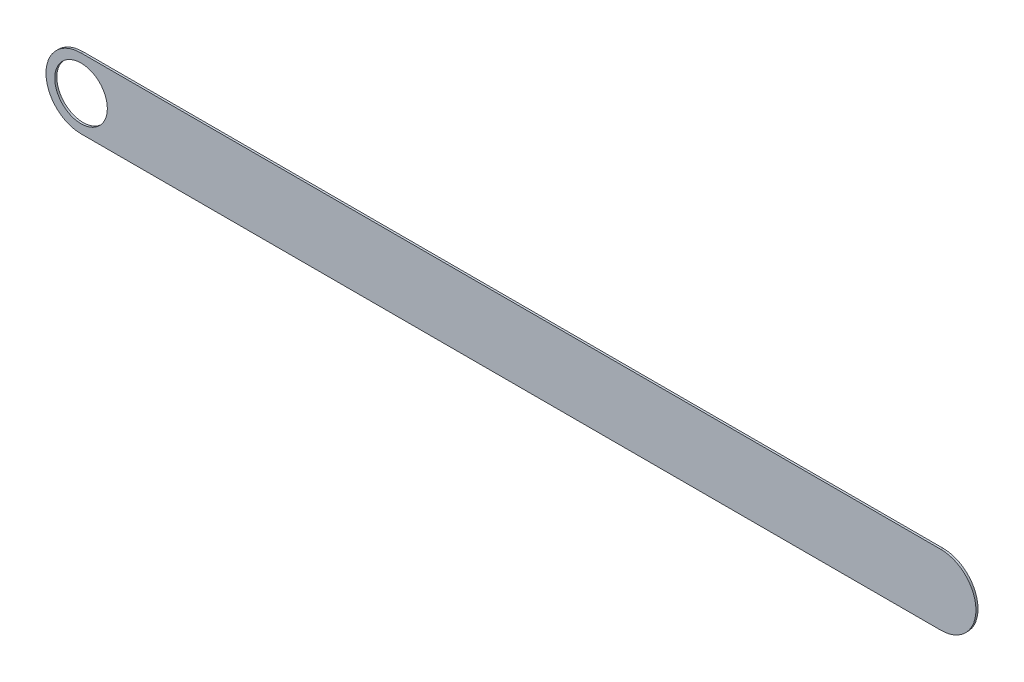
ISO-10303-21;
HEADER;
FILE_DESCRIPTION(('STEP AP214'),'2;1');
FILE_NAME('part.step','',(''),(''),'','','');
FILE_SCHEMA(('AUTOMOTIVE_DESIGN { 1 0 10303 214 1 1 1 1 }'));
ENDSEC;
DATA;
#1=APPLICATION_CONTEXT('core data for automotive mechanical design processes');
#2=APPLICATION_PROTOCOL_DEFINITION('international standard','automotive_design',2000,#1);
#3=PRODUCT_CONTEXT('',#1,'mechanical');
#4=PRODUCT('Part','Part','',(#3));
#5=PRODUCT_RELATED_PRODUCT_CATEGORY('part','',(#4));
#6=PRODUCT_DEFINITION_FORMATION('','',#4);
#7=PRODUCT_DEFINITION_CONTEXT('part definition',#1,'design');
#8=PRODUCT_DEFINITION('design','',#6,#7);
#9=PRODUCT_DEFINITION_SHAPE('','',#8);
#10=(LENGTH_UNIT() NAMED_UNIT(*) SI_UNIT(.MILLI.,.METRE.));
#11=(NAMED_UNIT(*) PLANE_ANGLE_UNIT() SI_UNIT($,.RADIAN.));
#12=(NAMED_UNIT(*) SI_UNIT($,.STERADIAN.) SOLID_ANGLE_UNIT());
#13=UNCERTAINTY_MEASURE_WITH_UNIT(LENGTH_MEASURE(1.E-05),#10,'distance_accuracy_value','');
#14=(GEOMETRIC_REPRESENTATION_CONTEXT(3) GLOBAL_UNCERTAINTY_ASSIGNED_CONTEXT((#13)) GLOBAL_UNIT_ASSIGNED_CONTEXT((#10,
#11,#12)) REPRESENTATION_CONTEXT('',''));
#15=CARTESIAN_POINT('',(0.,0.,0.));
#16=DIRECTION('',(0.,0.,1.));
#17=DIRECTION('',(1.,0.,0.));
#18=AXIS2_PLACEMENT_3D('',#15,#16,#17);
#19=CARTESIAN_POINT('',(35.8570276,70.4000116,0.));
#20=DIRECTION('',(0.,1.,0.));
#21=DIRECTION('',(1.,0.,0.));
#22=AXIS2_PLACEMENT_3D('',#19,#20,#21);
#23=PLANE('',#22);
#24=DIRECTION('',(1.,0.,0.));
#25=VECTOR('',#24,1.);
#26=CARTESIAN_POINT('',(35.8570276,70.4000116,0.03556));
#27=LINE('',#26,#25);
#28=CARTESIAN_POINT('',(35.8570276,70.4000116,0.03556));
#29=VERTEX_POINT('',#28);
#30=CARTESIAN_POINT('',(50.57998266,70.4000116,0.03556));
#31=VERTEX_POINT('',#30);
#32=EDGE_CURVE('E11',#29,#31,#27,.T.);
#33=ORIENTED_EDGE('',*,*,#32,.F.);
#34=DIRECTION('',(0.,0.,1.));
#35=VECTOR('',#34,1.);
#36=CARTESIAN_POINT('',(35.8570276,70.4000116,0.));
#37=LINE('',#36,#35);
#38=CARTESIAN_POINT('',(35.8570276,70.4000116,0.));
#39=VERTEX_POINT('',#38);
#40=EDGE_CURVE('E24',#39,#29,#37,.T.);
#41=ORIENTED_EDGE('',*,*,#40,.F.);
#42=DIRECTION('',(1.,0.,0.));
#43=VECTOR('',#42,1.);
#44=CARTESIAN_POINT('',(35.8570276,70.4000116,0.));
#45=LINE('',#44,#43);
#46=CARTESIAN_POINT('',(50.57998266,70.4000116,0.));
#47=VERTEX_POINT('',#46);
#48=EDGE_CURVE('E96',#39,#47,#45,.T.);
#49=ORIENTED_EDGE('',*,*,#48,.T.);
#50=DIRECTION('',(0.,0.,1.));
#51=VECTOR('',#50,1.);
#52=CARTESIAN_POINT('',(50.57998266,70.4000116,0.));
#53=LINE('',#52,#51);
#54=EDGE_CURVE('E37',#47,#31,#53,.T.);
#55=ORIENTED_EDGE('',*,*,#54,.T.);
#56=EDGE_LOOP('',(#33,#41,#49,#55));
#57=FACE_BOUND('',#56,.T.);
#58=ADVANCED_FACE('F17',(#57),#23,.F.);
#59=CARTESIAN_POINT('',(35.8570276,71.0000104,0.));
#60=DIRECTION('',(0.,0.,-1.));
#61=DIRECTION('',(0.,1.,0.));
#62=AXIS2_PLACEMENT_3D('',#59,#60,#61);
#63=CYLINDRICAL_SURFACE('',#62,0.599998799999999);
#64=CARTESIAN_POINT('',(35.8570276,71.0000104,0.03556));
#65=DIRECTION('',(0.,0.,1.));
#66=DIRECTION('',(0.,1.,0.));
#67=AXIS2_PLACEMENT_3D('',#64,#65,#66);
#68=CIRCLE('',#67,0.599998799999999);
#69=CARTESIAN_POINT('',(35.8570276,71.6000092,0.03556));
#70=VERTEX_POINT('',#69);
#71=EDGE_CURVE('E92',#70,#29,#68,.T.);
#72=ORIENTED_EDGE('',*,*,#71,.F.);
#73=DIRECTION('',(0.,0.,1.));
#74=VECTOR('',#73,1.);
#75=CARTESIAN_POINT('',(35.8570276,71.6000092,0.));
#76=LINE('',#75,#74);
#77=CARTESIAN_POINT('',(35.8570276,71.6000092,0.));
#78=VERTEX_POINT('',#77);
#79=EDGE_CURVE('E90',#78,#70,#76,.T.);
#80=ORIENTED_EDGE('',*,*,#79,.F.);
#81=CARTESIAN_POINT('',(35.8570276,71.0000104,0.));
#82=DIRECTION('',(0.,0.,1.));
#83=DIRECTION('',(0.,1.,0.));
#84=AXIS2_PLACEMENT_3D('',#81,#82,#83);
#85=CIRCLE('',#84,0.599998799999999);
#86=EDGE_CURVE('E88',#78,#39,#85,.T.);
#87=ORIENTED_EDGE('',*,*,#86,.T.);
#88=ORIENTED_EDGE('',*,*,#40,.T.);
#89=EDGE_LOOP('',(#72,#80,#87,#88));
#90=FACE_BOUND('',#89,.T.);
#91=ADVANCED_FACE('F111',(#90),#63,.T.);
#92=CARTESIAN_POINT('',(50.57998266,71.0000104,0.));
#93=DIRECTION('',(0.,0.,-1.));
#94=DIRECTION('',(0.,-1.,0.));
#95=AXIS2_PLACEMENT_3D('',#92,#93,#94);
#96=CYLINDRICAL_SURFACE('',#95,0.599998799999997);
#97=CARTESIAN_POINT('',(50.57998266,71.0000104,0.03556));
#98=DIRECTION('',(0.,0.,1.));
#99=DIRECTION('',(0.,-1.,0.));
#100=AXIS2_PLACEMENT_3D('',#97,#98,#99);
#101=CIRCLE('',#100,0.599998799999997);
#102=CARTESIAN_POINT('',(50.57998266,71.6000092,0.03556));
#103=VERTEX_POINT('',#102);
#104=EDGE_CURVE('E85',#31,#103,#101,.T.);
#105=ORIENTED_EDGE('',*,*,#104,.F.);
#106=ORIENTED_EDGE('',*,*,#54,.F.);
#107=CARTESIAN_POINT('',(50.57998266,71.0000104,0.));
#108=DIRECTION('',(0.,0.,1.));
#109=DIRECTION('',(0.,-1.,0.));
#110=AXIS2_PLACEMENT_3D('',#107,#108,#109);
#111=CIRCLE('',#110,0.599998799999997);
#112=CARTESIAN_POINT('',(50.57998266,71.6000092,0.));
#113=VERTEX_POINT('',#112);
#114=EDGE_CURVE('E82',#47,#113,#111,.T.);
#115=ORIENTED_EDGE('',*,*,#114,.T.);
#116=DIRECTION('',(0.,0.,1.));
#117=VECTOR('',#116,1.);
#118=CARTESIAN_POINT('',(50.57998266,71.6000092,0.));
#119=LINE('',#118,#117);
#120=EDGE_CURVE('E80',#113,#103,#119,.T.);
#121=ORIENTED_EDGE('',*,*,#120,.T.);
#122=EDGE_LOOP('',(#105,#106,#115,#121));
#123=FACE_BOUND('',#122,.T.);
#124=ADVANCED_FACE('F104',(#123),#96,.T.);
#125=CARTESIAN_POINT('',(50.57998266,71.6000092,0.));
#126=DIRECTION('',(0.,-1.,0.));
#127=DIRECTION('',(-1.,0.,0.));
#128=AXIS2_PLACEMENT_3D('',#125,#126,#127);
#129=PLANE('',#128);
#130=DIRECTION('',(-1.,0.,0.));
#131=VECTOR('',#130,1.);
#132=CARTESIAN_POINT('',(50.57998266,71.6000092,0.03556));
#133=LINE('',#132,#131);
#134=EDGE_CURVE('E77',#103,#70,#133,.T.);
#135=ORIENTED_EDGE('',*,*,#134,.F.);
#136=ORIENTED_EDGE('',*,*,#120,.F.);
#137=DIRECTION('',(-1.,0.,0.));
#138=VECTOR('',#137,1.);
#139=CARTESIAN_POINT('',(50.57998266,71.6000092,0.));
#140=LINE('',#139,#138);
#141=EDGE_CURVE('E68',#113,#78,#140,.T.);
#142=ORIENTED_EDGE('',*,*,#141,.T.);
#143=ORIENTED_EDGE('',*,*,#79,.T.);
#144=EDGE_LOOP('',(#135,#136,#142,#143));
#145=FACE_BOUND('',#144,.T.);
#146=ADVANCED_FACE('F110',(#145),#129,.F.);
#147=CARTESIAN_POINT('',(35.8570276,71.0000104,0.));
#148=DIRECTION('',(0.,0.,-1.));
#149=DIRECTION('',(1.,0.,0.));
#150=AXIS2_PLACEMENT_3D('',#147,#148,#149);
#151=CYLINDRICAL_SURFACE('',#150,0.4499991);
#152=DIRECTION('',(0.,0.,1.));
#153=VECTOR('',#152,1.);
#154=CARTESIAN_POINT('',(36.3070267,71.0000104,0.));
#155=LINE('',#154,#153);
#156=CARTESIAN_POINT('',(36.3070267,71.0000104,0.));
#157=VERTEX_POINT('',#156);
#158=CARTESIAN_POINT('',(36.3070267,71.0000104,0.03556));
#159=VERTEX_POINT('',#158);
#160=EDGE_CURVE('E62',#157,#159,#155,.T.);
#161=ORIENTED_EDGE('',*,*,#160,.T.);
#162=CARTESIAN_POINT('',(35.8570276,71.0000104,0.03556));
#163=DIRECTION('',(0.,0.,1.));
#164=DIRECTION('',(1.,0.,0.));
#165=AXIS2_PLACEMENT_3D('',#162,#163,#164);
#166=CIRCLE('',#165,0.4499991);
#167=EDGE_CURVE('E67',#159,#159,#166,.T.);
#168=ORIENTED_EDGE('',*,*,#167,.T.);
#169=ORIENTED_EDGE('',*,*,#160,.F.);
#170=CARTESIAN_POINT('',(35.8570276,71.0000104,0.));
#171=DIRECTION('',(0.,0.,1.));
#172=DIRECTION('',(1.,0.,0.));
#173=AXIS2_PLACEMENT_3D('',#170,#171,#172);
#174=CIRCLE('',#173,0.4499991);
#175=EDGE_CURVE('E65',#157,#157,#174,.T.);
#176=ORIENTED_EDGE('',*,*,#175,.F.);
#177=EDGE_LOOP('',(#161,#168,#169,#176));
#178=FACE_BOUND('',#177,.T.);
#179=ADVANCED_FACE('F64',(#178),#151,.F.);
#180=CARTESIAN_POINT('',(35.8570276,70.4000116,0.));
#181=DIRECTION('',(0.,0.,-1.));
#182=DIRECTION('',(-1.,0.,0.));
#183=AXIS2_PLACEMENT_3D('',#180,#181,#182);
#184=PLANE('',#183);
#185=ORIENTED_EDGE('',*,*,#48,.F.);
#186=ORIENTED_EDGE('',*,*,#86,.F.);
#187=ORIENTED_EDGE('',*,*,#141,.F.);
#188=ORIENTED_EDGE('',*,*,#114,.F.);
#189=EDGE_LOOP('',(#185,#186,#187,#188));
#190=FACE_BOUND('',#189,.T.);
#191=ORIENTED_EDGE('',*,*,#175,.T.);
#192=EDGE_LOOP('',(#191));
#193=FACE_BOUND('',#192,.T.);
#194=ADVANCED_FACE('F71',(#190,#193),#184,.T.);
#195=CARTESIAN_POINT('',(35.8570276,70.4000116,0.03556));
#196=DIRECTION('',(0.,0.,-1.));
#197=DIRECTION('',(-1.,0.,0.));
#198=AXIS2_PLACEMENT_3D('',#195,#196,#197);
#199=PLANE('',#198);
#200=ORIENTED_EDGE('',*,*,#134,.T.);
#201=ORIENTED_EDGE('',*,*,#71,.T.);
#202=ORIENTED_EDGE('',*,*,#32,.T.);
#203=ORIENTED_EDGE('',*,*,#104,.T.);
#204=EDGE_LOOP('',(#200,#201,#202,#203));
#205=FACE_BOUND('',#204,.T.);
#206=ORIENTED_EDGE('',*,*,#167,.F.);
#207=EDGE_LOOP('',(#206));
#208=FACE_BOUND('',#207,.T.);
#209=ADVANCED_FACE('F107',(#205,#208),#199,.F.);
#210=CLOSED_SHELL('',(#58,#91,#124,#146,#179,#194,#209));
#211=MANIFOLD_SOLID_BREP('B1',#210);
#212=ADVANCED_BREP_SHAPE_REPRESENTATION('',(#18,#211),#14);
#213=SHAPE_DEFINITION_REPRESENTATION(#9,#212);
ENDSEC;
END-ISO-10303-21;
